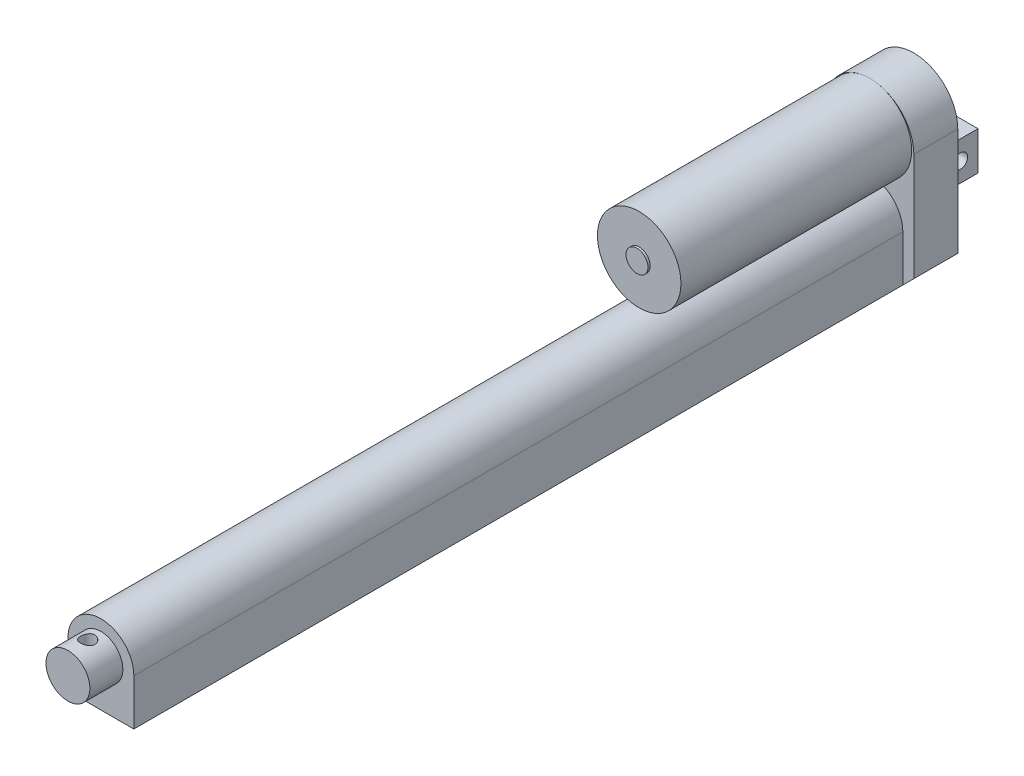
ISO-10303-21;
HEADER;
FILE_DESCRIPTION(('STEP AP214'),'2;1');
FILE_NAME('part.step','',(''),(''),'','','');
FILE_SCHEMA(('AUTOMOTIVE_DESIGN { 1 0 10303 214 1 1 1 1 }'));
ENDSEC;
DATA;
#1=APPLICATION_CONTEXT('core data for automotive mechanical design processes');
#2=APPLICATION_PROTOCOL_DEFINITION('international standard','automotive_design',2000,#1);
#3=PRODUCT_CONTEXT('',#1,'mechanical');
#4=PRODUCT('Part','Part','',(#3));
#5=PRODUCT_RELATED_PRODUCT_CATEGORY('part','',(#4));
#6=PRODUCT_DEFINITION_FORMATION('','',#4);
#7=PRODUCT_DEFINITION_CONTEXT('part definition',#1,'design');
#8=PRODUCT_DEFINITION('design','',#6,#7);
#9=PRODUCT_DEFINITION_SHAPE('','',#8);
#10=(LENGTH_UNIT() NAMED_UNIT(*) SI_UNIT(.MILLI.,.METRE.));
#11=(NAMED_UNIT(*) PLANE_ANGLE_UNIT() SI_UNIT($,.RADIAN.));
#12=(NAMED_UNIT(*) SI_UNIT($,.STERADIAN.) SOLID_ANGLE_UNIT());
#13=UNCERTAINTY_MEASURE_WITH_UNIT(LENGTH_MEASURE(1.E-05),#10,'distance_accuracy_value','');
#14=(GEOMETRIC_REPRESENTATION_CONTEXT(3) GLOBAL_UNCERTAINTY_ASSIGNED_CONTEXT((#13)) GLOBAL_UNIT_ASSIGNED_CONTEXT((#10,
#11,#12)) REPRESENTATION_CONTEXT('',''));
#15=CARTESIAN_POINT('',(0.,0.,0.));
#16=DIRECTION('',(0.,0.,1.));
#17=DIRECTION('',(1.,0.,0.));
#18=AXIS2_PLACEMENT_3D('',#15,#16,#17);
#19=CARTESIAN_POINT('',(0.,-16.,370.));
#20=DIRECTION('',(0.,0.,-1.));
#21=DIRECTION('',(-1.,0.,0.));
#22=AXIS2_PLACEMENT_3D('',#19,#20,#21);
#23=CYLINDRICAL_SURFACE('',#22,15.);
#24=DIRECTION('',(0.,0.,-1.));
#25=VECTOR('',#24,1.);
#26=CARTESIAN_POINT('',(-15.,-16.,370.));
#27=LINE('',#26,#25);
#28=CARTESIAN_POINT('',(-15.,-16.,370.));
#29=VERTEX_POINT('',#28);
#30=CARTESIAN_POINT('',(-15.,-16.,20.));
#31=VERTEX_POINT('',#30);
#32=EDGE_CURVE('E201',#29,#31,#27,.T.);
#33=ORIENTED_EDGE('',*,*,#32,.F.);
#34=CARTESIAN_POINT('',(0.,-16.,370.));
#35=DIRECTION('',(0.,0.,-1.));
#36=DIRECTION('',(-1.,0.,0.));
#37=AXIS2_PLACEMENT_3D('',#34,#35,#36);
#38=CIRCLE('',#37,15.);
#39=CARTESIAN_POINT('',(15.,-16.,370.));
#40=VERTEX_POINT('',#39);
#41=EDGE_CURVE('E259',#40,#29,#38,.F.);
#42=ORIENTED_EDGE('',*,*,#41,.F.);
#43=DIRECTION('',(0.,0.,-1.));
#44=VECTOR('',#43,1.);
#45=CARTESIAN_POINT('',(15.,-16.,370.));
#46=LINE('',#45,#44);
#47=CARTESIAN_POINT('',(15.,-16.,20.));
#48=VERTEX_POINT('',#47);
#49=EDGE_CURVE('E256',#48,#40,#46,.F.);
#50=ORIENTED_EDGE('',*,*,#49,.F.);
#51=CARTESIAN_POINT('',(0.,-16.,20.));
#52=DIRECTION('',(0.,0.,-1.));
#53=DIRECTION('',(-1.,0.,0.));
#54=AXIS2_PLACEMENT_3D('',#51,#52,#53);
#55=CIRCLE('',#54,15.);
#56=EDGE_CURVE('E52',#48,#31,#55,.F.);
#57=ORIENTED_EDGE('',*,*,#56,.T.);
#58=EDGE_LOOP('',(#33,#42,#50,#57));
#59=FACE_BOUND('',#58,.T.);
#60=ADVANCED_FACE('F38',(#59),#23,.T.);
#61=CARTESIAN_POINT('',(0.,0.,20.));
#62=DIRECTION('',(0.,0.,-1.));
#63=DIRECTION('',(-1.,0.,0.));
#64=AXIS2_PLACEMENT_3D('',#61,#62,#63);
#65=PLANE('',#64);
#66=DIRECTION('',(0.,-1.,0.));
#67=VECTOR('',#66,1.);
#68=CARTESIAN_POINT('',(-15.,-37.,20.));
#69=LINE('',#68,#67);
#70=CARTESIAN_POINT('',(-15.,-37.,20.));
#71=VERTEX_POINT('',#70);
#72=EDGE_CURVE('E175',#31,#71,#69,.T.);
#73=ORIENTED_EDGE('',*,*,#72,.F.);
#74=ORIENTED_EDGE('',*,*,#56,.F.);
#75=DIRECTION('',(0.,1.,0.));
#76=VECTOR('',#75,1.);
#77=CARTESIAN_POINT('',(15.,-37.,20.));
#78=LINE('',#77,#76);
#79=CARTESIAN_POINT('',(15.,-37.,20.));
#80=VERTEX_POINT('',#79);
#81=EDGE_CURVE('E180',#80,#48,#78,.T.);
#82=ORIENTED_EDGE('',*,*,#81,.F.);
#83=DIRECTION('',(-0.70710678118655,-0.707106781186546,0.));
#84=VECTOR('',#83,1.);
#85=CARTESIAN_POINT('',(20.,-32.,20.));
#86=LINE('',#85,#84);
#87=CARTESIAN_POINT('',(20.,-32.,20.));
#88=VERTEX_POINT('',#87);
#89=EDGE_CURVE('E252',#80,#88,#86,.F.);
#90=ORIENTED_EDGE('',*,*,#89,.T.);
#91=DIRECTION('',(0.,1.,0.));
#92=VECTOR('',#91,1.);
#93=CARTESIAN_POINT('',(20.,-37.,20.));
#94=LINE('',#93,#92);
#95=CARTESIAN_POINT('',(20.,17.,20.));
#96=VERTEX_POINT('',#95);
#97=EDGE_CURVE('E209',#88,#96,#94,.T.);
#98=ORIENTED_EDGE('',*,*,#97,.T.);
#99=CARTESIAN_POINT('',(0.,17.,20.));
#100=DIRECTION('',(0.,0.,-1.));
#101=DIRECTION('',(-1.,0.,0.));
#102=AXIS2_PLACEMENT_3D('',#99,#100,#101);
#103=CIRCLE('',#102,20.);
#104=CARTESIAN_POINT('',(4.11295489826725,36.5725216056802,20.));
#105=VERTEX_POINT('',#104);
#106=EDGE_CURVE('E231',#96,#105,#103,.F.);
#107=ORIENTED_EDGE('',*,*,#106,.T.);
#108=CARTESIAN_POINT('',(0.,18.0230309925982,20.));
#109=DIRECTION('',(0.,0.,1.));
#110=DIRECTION('',(1.,0.,0.));
#111=AXIS2_PLACEMENT_3D('',#108,#109,#110);
#112=CIRCLE('',#111,19.);
#113=CARTESIAN_POINT('',(-4.11295489826713,36.5725216056803,20.));
#114=VERTEX_POINT('',#113);
#115=EDGE_CURVE('E202',#114,#105,#112,.T.);
#116=ORIENTED_EDGE('',*,*,#115,.F.);
#117=CARTESIAN_POINT('',(-20.,17.,20.));
#118=VERTEX_POINT('',#117);
#119=EDGE_CURVE('E230',#114,#118,#103,.F.);
#120=ORIENTED_EDGE('',*,*,#119,.T.);
#121=DIRECTION('',(0.,-1.,0.));
#122=VECTOR('',#121,1.);
#123=CARTESIAN_POINT('',(-20.,-37.,20.));
#124=LINE('',#123,#122);
#125=CARTESIAN_POINT('',(-20.,-32.,20.));
#126=VERTEX_POINT('',#125);
#127=EDGE_CURVE('E211',#118,#126,#124,.T.);
#128=ORIENTED_EDGE('',*,*,#127,.T.);
#129=DIRECTION('',(-0.707106781186547,0.707106781186549,0.));
#130=VECTOR('',#129,1.);
#131=CARTESIAN_POINT('',(-15.,-37.,20.));
#132=LINE('',#131,#130);
#133=EDGE_CURVE('E241',#126,#71,#132,.F.);
#134=ORIENTED_EDGE('',*,*,#133,.T.);
#135=EDGE_LOOP('',(#73,#74,#82,#90,#98,#107,#116,#120,#128,#134));
#136=FACE_BOUND('',#135,.T.);
#137=ADVANCED_FACE('F284',(#136),#65,.F.);
#138=CARTESIAN_POINT('',(0.,17.,0.));
#139=DIRECTION('',(0.,0.,-1.));
#140=DIRECTION('',(-1.,0.,0.));
#141=AXIS2_PLACEMENT_3D('',#138,#139,#140);
#142=CYLINDRICAL_SURFACE('',#141,20.);
#143=DIRECTION('',(0.,0.,-1.));
#144=VECTOR('',#143,1.);
#145=CARTESIAN_POINT('',(20.,17.,20.));
#146=LINE('',#145,#144);
#147=CARTESIAN_POINT('',(20.,17.,0.));
#148=VERTEX_POINT('',#147);
#149=EDGE_CURVE('E215',#148,#96,#146,.F.);
#150=ORIENTED_EDGE('',*,*,#149,.F.);
#151=CARTESIAN_POINT('',(0.,17.,0.));
#152=DIRECTION('',(0.,0.,-1.));
#153=DIRECTION('',(-1.,0.,0.));
#154=AXIS2_PLACEMENT_3D('',#151,#152,#153);
#155=CIRCLE('',#154,20.);
#156=CARTESIAN_POINT('',(-20.,17.,0.));
#157=VERTEX_POINT('',#156);
#158=EDGE_CURVE('E227',#157,#148,#155,.T.);
#159=ORIENTED_EDGE('',*,*,#158,.F.);
#160=DIRECTION('',(0.,0.,-1.));
#161=VECTOR('',#160,1.);
#162=CARTESIAN_POINT('',(-20.,17.,20.));
#163=LINE('',#162,#161);
#164=EDGE_CURVE('E224',#118,#157,#163,.T.);
#165=ORIENTED_EDGE('',*,*,#164,.F.);
#166=ORIENTED_EDGE('',*,*,#119,.F.);
#167=EDGE_CURVE('E234',#105,#114,#103,.F.);
#168=ORIENTED_EDGE('',*,*,#167,.F.);
#169=ORIENTED_EDGE('',*,*,#106,.F.);
#170=EDGE_LOOP('',(#150,#159,#165,#166,#168,#169));
#171=FACE_BOUND('',#170,.T.);
#172=ADVANCED_FACE('F289',(#171),#142,.T.);
#173=CARTESIAN_POINT('',(20.,-37.,20.));
#174=DIRECTION('',(-1.,0.,0.));
#175=DIRECTION('',(0.,0.,1.));
#176=AXIS2_PLACEMENT_3D('',#173,#174,#175);
#177=PLANE('',#176);
#178=ORIENTED_EDGE('',*,*,#97,.F.);
#179=DIRECTION('',(0.,0.,-1.));
#180=VECTOR('',#179,1.);
#181=CARTESIAN_POINT('',(20.,-32.,20.));
#182=LINE('',#181,#180);
#183=CARTESIAN_POINT('',(20.,-32.,0.));
#184=VERTEX_POINT('',#183);
#185=EDGE_CURVE('E244',#88,#184,#182,.T.);
#186=ORIENTED_EDGE('',*,*,#185,.T.);
#187=DIRECTION('',(0.,1.,0.));
#188=VECTOR('',#187,1.);
#189=CARTESIAN_POINT('',(20.,-37.,0.));
#190=LINE('',#189,#188);
#191=EDGE_CURVE('E206',#184,#148,#190,.T.);
#192=ORIENTED_EDGE('',*,*,#191,.T.);
#193=ORIENTED_EDGE('',*,*,#149,.T.);
#194=EDGE_LOOP('',(#178,#186,#192,#193));
#195=FACE_BOUND('',#194,.T.);
#196=ADVANCED_FACE('F325',(#195),#177,.F.);
#197=CARTESIAN_POINT('',(-20.,-37.,20.));
#198=DIRECTION('',(1.,0.,0.));
#199=DIRECTION('',(0.,0.,-1.));
#200=AXIS2_PLACEMENT_3D('',#197,#198,#199);
#201=PLANE('',#200);
#202=DIRECTION('',(0.,-1.,0.));
#203=VECTOR('',#202,1.);
#204=CARTESIAN_POINT('',(-20.,-37.,0.));
#205=LINE('',#204,#203);
#206=CARTESIAN_POINT('',(-20.,-32.,0.));
#207=VERTEX_POINT('',#206);
#208=EDGE_CURVE('E217',#157,#207,#205,.T.);
#209=ORIENTED_EDGE('',*,*,#208,.T.);
#210=DIRECTION('',(0.,0.,1.));
#211=VECTOR('',#210,1.);
#212=CARTESIAN_POINT('',(-20.,-32.,20.));
#213=LINE('',#212,#211);
#214=EDGE_CURVE('E239',#207,#126,#213,.T.);
#215=ORIENTED_EDGE('',*,*,#214,.T.);
#216=ORIENTED_EDGE('',*,*,#127,.F.);
#217=ORIENTED_EDGE('',*,*,#164,.T.);
#218=EDGE_LOOP('',(#209,#215,#216,#217));
#219=FACE_BOUND('',#218,.T.);
#220=ADVANCED_FACE('F355',(#219),#201,.F.);
#221=CARTESIAN_POINT('',(-20.,-37.,20.));
#222=DIRECTION('',(0.,1.,0.));
#223=DIRECTION('',(0.,0.,1.));
#224=AXIS2_PLACEMENT_3D('',#221,#222,#223);
#225=PLANE('',#224);
#226=DIRECTION('',(1.,0.,0.));
#227=VECTOR('',#226,1.);
#228=CARTESIAN_POINT('',(-20.,-37.,0.));
#229=LINE('',#228,#227);
#230=CARTESIAN_POINT('',(-15.,-37.,0.));
#231=VERTEX_POINT('',#230);
#232=CARTESIAN_POINT('',(15.,-37.,0.));
#233=VERTEX_POINT('',#232);
#234=EDGE_CURVE('E212',#231,#233,#229,.T.);
#235=ORIENTED_EDGE('',*,*,#234,.T.);
#236=DIRECTION('',(0.,0.,1.));
#237=VECTOR('',#236,1.);
#238=CARTESIAN_POINT('',(15.,-37.,20.));
#239=LINE('',#238,#237);
#240=EDGE_CURVE('E249',#233,#80,#239,.T.);
#241=ORIENTED_EDGE('',*,*,#240,.T.);
#242=DIRECTION('',(0.,0.,-1.));
#243=VECTOR('',#242,1.);
#244=CARTESIAN_POINT('',(15.,-37.,370.));
#245=LINE('',#244,#243);
#246=CARTESIAN_POINT('',(15.,-37.,370.));
#247=VERTEX_POINT('',#246);
#248=EDGE_CURVE('E185',#247,#80,#245,.T.);
#249=ORIENTED_EDGE('',*,*,#248,.F.);
#250=DIRECTION('',(1.,0.,0.));
#251=VECTOR('',#250,1.);
#252=CARTESIAN_POINT('',(-15.,-37.,370.));
#253=LINE('',#252,#251);
#254=CARTESIAN_POINT('',(-15.,-37.,370.));
#255=VERTEX_POINT('',#254);
#256=EDGE_CURVE('E179',#255,#247,#253,.T.);
#257=ORIENTED_EDGE('',*,*,#256,.F.);
#258=DIRECTION('',(0.,0.,-1.));
#259=VECTOR('',#258,1.);
#260=CARTESIAN_POINT('',(-15.,-37.,370.));
#261=LINE('',#260,#259);
#262=EDGE_CURVE('E191',#255,#71,#261,.T.);
#263=ORIENTED_EDGE('',*,*,#262,.T.);
#264=DIRECTION('',(0.,0.,-1.));
#265=VECTOR('',#264,1.);
#266=CARTESIAN_POINT('',(-15.,-37.,20.));
#267=LINE('',#266,#265);
#268=EDGE_CURVE('E233',#71,#231,#267,.T.);
#269=ORIENTED_EDGE('',*,*,#268,.T.);
#270=EDGE_LOOP('',(#235,#241,#249,#257,#263,#269));
#271=FACE_BOUND('',#270,.T.);
#272=ADVANCED_FACE('F303',(#271),#225,.F.);
#273=CARTESIAN_POINT('',(0.,0.,0.));
#274=DIRECTION('',(0.,0.,-1.));
#275=DIRECTION('',(-1.,0.,0.));
#276=AXIS2_PLACEMENT_3D('',#273,#274,#275);
#277=PLANE('',#276);
#278=DIRECTION('',(0.,1.,0.));
#279=VECTOR('',#278,1.);
#280=CARTESIAN_POINT('',(-7.29139016690268,2.74999999999999,0.));
#281=LINE('',#280,#279);
#282=CARTESIAN_POINT('',(-7.29139016690269,-14.75,0.));
#283=VERTEX_POINT('',#282);
#284=CARTESIAN_POINT('',(-7.29139016690268,2.74999999999999,0.));
#285=VERTEX_POINT('',#284);
#286=EDGE_CURVE('E60',#283,#285,#281,.T.);
#287=ORIENTED_EDGE('',*,*,#286,.F.);
#288=DIRECTION('',(-1.,0.,0.));
#289=VECTOR('',#288,1.);
#290=CARTESIAN_POINT('',(10.2086098330973,-14.75,0.));
#291=LINE('',#290,#289);
#292=CARTESIAN_POINT('',(10.2086098330973,-14.75,0.));
#293=VERTEX_POINT('',#292);
#294=EDGE_CURVE('E64',#293,#283,#291,.T.);
#295=ORIENTED_EDGE('',*,*,#294,.F.);
#296=DIRECTION('',(0.,-1.,0.));
#297=VECTOR('',#296,1.);
#298=CARTESIAN_POINT('',(10.2086098330973,2.74999999999999,0.));
#299=LINE('',#298,#297);
#300=CARTESIAN_POINT('',(10.2086098330973,2.74999999999999,0.));
#301=VERTEX_POINT('',#300);
#302=EDGE_CURVE('E510',#301,#293,#299,.T.);
#303=ORIENTED_EDGE('',*,*,#302,.F.);
#304=DIRECTION('',(1.,0.,0.));
#305=VECTOR('',#304,1.);
#306=CARTESIAN_POINT('',(10.2086098330973,2.74999999999999,0.));
#307=LINE('',#306,#305);
#308=EDGE_CURVE('E502',#285,#301,#307,.T.);
#309=ORIENTED_EDGE('',*,*,#308,.F.);
#310=EDGE_LOOP('',(#287,#295,#303,#309));
#311=FACE_BOUND('',#310,.T.);
#312=ORIENTED_EDGE('',*,*,#191,.F.);
#313=DIRECTION('',(0.70710678118655,0.707106781186546,0.));
#314=VECTOR('',#313,1.);
#315=CARTESIAN_POINT('',(25.9999999999999,-26.0000000000001,0.));
#316=LINE('',#315,#314);
#317=EDGE_CURVE('E247',#184,#233,#316,.F.);
#318=ORIENTED_EDGE('',*,*,#317,.T.);
#319=ORIENTED_EDGE('',*,*,#234,.F.);
#320=DIRECTION('',(0.707106781186547,-0.707106781186549,0.));
#321=VECTOR('',#320,1.);
#322=CARTESIAN_POINT('',(-26.,-26.,0.));
#323=LINE('',#322,#321);
#324=EDGE_CURVE('E237',#231,#207,#323,.F.);
#325=ORIENTED_EDGE('',*,*,#324,.T.);
#326=ORIENTED_EDGE('',*,*,#208,.F.);
#327=ORIENTED_EDGE('',*,*,#158,.T.);
#328=EDGE_LOOP('',(#312,#318,#319,#325,#326,#327));
#329=FACE_BOUND('',#328,.T.);
#330=ADVANCED_FACE('F319',(#311,#329),#277,.T.);
#331=CARTESIAN_POINT('',(-15.,-37.,20.));
#332=DIRECTION('',(0.707106781186549,0.707106781186547,0.));
#333=DIRECTION('',(0.,0.,-1.));
#334=AXIS2_PLACEMENT_3D('',#331,#332,#333);
#335=PLANE('',#334);
#336=ORIENTED_EDGE('',*,*,#133,.F.);
#337=ORIENTED_EDGE('',*,*,#214,.F.);
#338=ORIENTED_EDGE('',*,*,#324,.F.);
#339=ORIENTED_EDGE('',*,*,#268,.F.);
#340=EDGE_LOOP('',(#336,#337,#338,#339));
#341=FACE_BOUND('',#340,.T.);
#342=ADVANCED_FACE('F315',(#341),#335,.F.);
#343=CARTESIAN_POINT('',(20.,-32.,20.));
#344=DIRECTION('',(-0.707106781186546,0.70710678118655,0.));
#345=DIRECTION('',(0.,0.,-1.));
#346=AXIS2_PLACEMENT_3D('',#343,#344,#345);
#347=PLANE('',#346);
#348=ORIENTED_EDGE('',*,*,#89,.F.);
#349=ORIENTED_EDGE('',*,*,#240,.F.);
#350=ORIENTED_EDGE('',*,*,#317,.F.);
#351=ORIENTED_EDGE('',*,*,#185,.F.);
#352=EDGE_LOOP('',(#348,#349,#350,#351));
#353=FACE_BOUND('',#352,.T.);
#354=ADVANCED_FACE('F323',(#353),#347,.F.);
#355=CARTESIAN_POINT('',(0.,18.0230309925982,20.));
#356=DIRECTION('',(0.,0.,1.));
#357=DIRECTION('',(1.,0.,0.));
#358=AXIS2_PLACEMENT_3D('',#355,#356,#357);
#359=PLANE('',#358);
#360=EDGE_CURVE('E197',#105,#114,#112,.T.);
#361=ORIENTED_EDGE('',*,*,#360,.F.);
#362=ORIENTED_EDGE('',*,*,#167,.T.);
#363=EDGE_LOOP('',(#361,#362));
#364=FACE_BOUND('',#363,.T.);
#365=ADVANCED_FACE('F338',(#364),#359,.F.);
#366=CARTESIAN_POINT('',(0.,18.0230309925982,125.));
#367=DIRECTION('',(0.,0.,-1.));
#368=DIRECTION('',(-1.,0.,0.));
#369=AXIS2_PLACEMENT_3D('',#366,#367,#368);
#370=CYLINDRICAL_SURFACE('',#369,19.);
#371=CARTESIAN_POINT('',(0.,18.0230309925982,125.));
#372=DIRECTION('',(0.,0.,1.));
#373=DIRECTION('',(1.,0.,0.));
#374=AXIS2_PLACEMENT_3D('',#371,#372,#373);
#375=CIRCLE('',#374,19.);
#376=CARTESIAN_POINT('',(19.,18.0230309925982,125.));
#377=VERTEX_POINT('',#376);
#378=EDGE_CURVE('E203',#377,#377,#375,.T.);
#379=ORIENTED_EDGE('',*,*,#378,.F.);
#380=EDGE_LOOP('',(#379));
#381=FACE_BOUND('',#380,.T.);
#382=ORIENTED_EDGE('',*,*,#360,.T.);
#383=ORIENTED_EDGE('',*,*,#115,.T.);
#384=EDGE_LOOP('',(#382,#383));
#385=FACE_BOUND('',#384,.T.);
#386=ADVANCED_FACE('F337',(#381,#385),#370,.T.);
#387=CARTESIAN_POINT('',(0.,18.0230309925982,125.));
#388=DIRECTION('',(0.,0.,1.));
#389=DIRECTION('',(1.,0.,0.));
#390=AXIS2_PLACEMENT_3D('',#387,#388,#389);
#391=PLANE('',#390);
#392=CARTESIAN_POINT('',(0.,18.0230309925982,125.));
#393=DIRECTION('',(0.,0.,1.));
#394=DIRECTION('',(1.,0.,0.));
#395=AXIS2_PLACEMENT_3D('',#392,#393,#394);
#396=CIRCLE('',#395,5.);
#397=CARTESIAN_POINT('',(5.,18.0230309925982,125.));
#398=VERTEX_POINT('',#397);
#399=EDGE_CURVE('E198',#398,#398,#396,.T.);
#400=ORIENTED_EDGE('',*,*,#399,.F.);
#401=EDGE_LOOP('',(#400));
#402=FACE_BOUND('',#401,.T.);
#403=ORIENTED_EDGE('',*,*,#378,.T.);
#404=EDGE_LOOP('',(#403));
#405=FACE_BOUND('',#404,.T.);
#406=ADVANCED_FACE('F345',(#402,#405),#391,.T.);
#407=CARTESIAN_POINT('',(0.,18.0230309925982,126.));
#408=DIRECTION('',(0.,0.,-1.));
#409=DIRECTION('',(-1.,0.,0.));
#410=AXIS2_PLACEMENT_3D('',#407,#408,#409);
#411=CYLINDRICAL_SURFACE('',#410,5.);
#412=CARTESIAN_POINT('',(0.,18.0230309925982,126.));
#413=DIRECTION('',(0.,0.,1.));
#414=DIRECTION('',(1.,0.,0.));
#415=AXIS2_PLACEMENT_3D('',#412,#413,#414);
#416=CIRCLE('',#415,5.);
#417=CARTESIAN_POINT('',(5.,18.0230309925982,126.));
#418=VERTEX_POINT('',#417);
#419=EDGE_CURVE('E194',#418,#418,#416,.T.);
#420=ORIENTED_EDGE('',*,*,#419,.F.);
#421=EDGE_LOOP('',(#420));
#422=FACE_BOUND('',#421,.T.);
#423=ORIENTED_EDGE('',*,*,#399,.T.);
#424=EDGE_LOOP('',(#423));
#425=FACE_BOUND('',#424,.T.);
#426=ADVANCED_FACE('F544',(#422,#425),#411,.T.);
#427=CARTESIAN_POINT('',(0.,18.0230309925982,126.));
#428=DIRECTION('',(0.,0.,1.));
#429=DIRECTION('',(1.,0.,0.));
#430=AXIS2_PLACEMENT_3D('',#427,#428,#429);
#431=PLANE('',#430);
#432=ORIENTED_EDGE('',*,*,#419,.T.);
#433=EDGE_LOOP('',(#432));
#434=FACE_BOUND('',#433,.T.);
#435=ADVANCED_FACE('F400',(#434),#431,.T.);
#436=CARTESIAN_POINT('',(-15.,-37.,370.));
#437=DIRECTION('',(1.,0.,0.));
#438=DIRECTION('',(0.,1.,0.));
#439=AXIS2_PLACEMENT_3D('',#436,#437,#438);
#440=PLANE('',#439);
#441=DIRECTION('',(0.,-1.,0.));
#442=VECTOR('',#441,1.);
#443=CARTESIAN_POINT('',(-15.,-37.,370.));
#444=LINE('',#443,#442);
#445=EDGE_CURVE('E177',#29,#255,#444,.T.);
#446=ORIENTED_EDGE('',*,*,#445,.F.);
#447=ORIENTED_EDGE('',*,*,#32,.T.);
#448=ORIENTED_EDGE('',*,*,#72,.T.);
#449=ORIENTED_EDGE('',*,*,#262,.F.);
#450=EDGE_LOOP('',(#446,#447,#448,#449));
#451=FACE_BOUND('',#450,.T.);
#452=ADVANCED_FACE('F298',(#451),#440,.F.);
#453=CARTESIAN_POINT('',(15.,-37.,370.));
#454=DIRECTION('',(-1.,0.,0.));
#455=DIRECTION('',(0.,-1.,0.));
#456=AXIS2_PLACEMENT_3D('',#453,#454,#455);
#457=PLANE('',#456);
#458=ORIENTED_EDGE('',*,*,#81,.T.);
#459=ORIENTED_EDGE('',*,*,#49,.T.);
#460=DIRECTION('',(0.,1.,0.));
#461=VECTOR('',#460,1.);
#462=CARTESIAN_POINT('',(15.,-37.,370.));
#463=LINE('',#462,#461);
#464=EDGE_CURVE('E182',#247,#40,#463,.T.);
#465=ORIENTED_EDGE('',*,*,#464,.F.);
#466=ORIENTED_EDGE('',*,*,#248,.T.);
#467=EDGE_LOOP('',(#458,#459,#465,#466));
#468=FACE_BOUND('',#467,.T.);
#469=ADVANCED_FACE('F308',(#468),#457,.F.);
#470=CARTESIAN_POINT('',(0.,0.,370.));
#471=DIRECTION('',(0.,0.,-1.));
#472=DIRECTION('',(-1.,0.,0.));
#473=AXIS2_PLACEMENT_3D('',#470,#471,#472);
#474=PLANE('',#473);
#475=CARTESIAN_POINT('',(0.,-16.,370.));
#476=DIRECTION('',(0.,0.,1.));
#477=DIRECTION('',(1.,0.,0.));
#478=AXIS2_PLACEMENT_3D('',#475,#476,#477);
#479=CIRCLE('',#478,10.);
#480=CARTESIAN_POINT('',(10.,-16.,370.));
#481=VERTEX_POINT('',#480);
#482=EDGE_CURVE('E11',#481,#481,#479,.T.);
#483=ORIENTED_EDGE('',*,*,#482,.F.);
#484=EDGE_LOOP('',(#483));
#485=FACE_BOUND('',#484,.T.);
#486=ORIENTED_EDGE('',*,*,#464,.T.);
#487=ORIENTED_EDGE('',*,*,#41,.T.);
#488=ORIENTED_EDGE('',*,*,#445,.T.);
#489=ORIENTED_EDGE('',*,*,#256,.T.);
#490=EDGE_LOOP('',(#486,#487,#488,#489));
#491=FACE_BOUND('',#490,.T.);
#492=ADVANCED_FACE('F281',(#485,#491),#474,.F.);
#493=CARTESIAN_POINT('',(0.,-16.,385.));
#494=DIRECTION('',(0.,0.,-1.));
#495=DIRECTION('',(-1.,0.,0.));
#496=AXIS2_PLACEMENT_3D('',#493,#494,#495);
#497=CYLINDRICAL_SURFACE('',#496,10.);
#498=CARTESIAN_POINT('',(0.,-26.,379.25));
#499=CARTESIAN_POINT('',(0.177579382949036,-25.9999998937457,379.249999978893));
#500=CARTESIAN_POINT('',(0.355160799428115,-25.9952257938611,379.235398036528));
#501=CARTESIAN_POINT('',(0.705108112257467,-25.9766501782423,379.177544333272));
#502=CARTESIAN_POINT('',(0.8774732056413,-25.9628472799953,379.134288184761));
#503=CARTESIAN_POINT('',(1.21189182680223,-25.9277171600686,379.020754772825));
#504=CARTESIAN_POINT('',(1.37396158278685,-25.9064021452577,378.950521329808));
#505=CARTESIAN_POINT('',(1.684022624021,-25.8584336143887,378.785220348216));
#506=CARTESIAN_POINT('',(1.83201134569424,-25.8317791289656,378.690148299311));
#507=CARTESIAN_POINT('',(2.11461081148199,-25.774959322478,378.474558938708));
#508=CARTESIAN_POINT('',(2.24869037174636,-25.7447129535853,378.353366806204));
#509=CARTESIAN_POINT('',(2.49502344091046,-25.6845736848256,378.090413033913));
#510=CARTESIAN_POINT('',(2.60727245498121,-25.6546808589392,377.94864716854));
#511=CARTESIAN_POINT('',(2.80972801137825,-25.5977505604902,377.643862973249));
#512=CARTESIAN_POINT('',(2.89925504445897,-25.5708123772724,377.480372950202));
#513=CARTESIAN_POINT('',(3.04931887139799,-25.5240683082348,377.139640099792));
#514=CARTESIAN_POINT('',(3.10986401524674,-25.5042603685244,376.962401250734));
#515=CARTESIAN_POINT('',(3.19827260971519,-25.4748706234853,376.605224003478));
#516=CARTESIAN_POINT('',(3.2271274104268,-25.4649795222656,376.425557170357));
#517=CARTESIAN_POINT('',(3.25443459132067,-25.4556270749359,376.063681042994));
#518=CARTESIAN_POINT('',(3.25289582251765,-25.4561626924252,375.881472504376));
#519=CARTESIAN_POINT('',(3.22023155138037,-25.4673313142313,375.528034921642));
#520=CARTESIAN_POINT('',(3.19038591816139,-25.4775275041788,375.356671424264));
#521=CARTESIAN_POINT('',(3.10403782395806,-25.5061557481236,375.021530266182));
#522=CARTESIAN_POINT('',(3.04753231830216,-25.5245887427866,374.85775347426));
#523=CARTESIAN_POINT('',(2.90860404188739,-25.5679344005213,374.539469725231));
#524=CARTESIAN_POINT('',(2.82579288678076,-25.5929431291382,374.385145941743));
#525=CARTESIAN_POINT('',(2.6368736518591,-25.6465806248091,374.092174070327));
#526=CARTESIAN_POINT('',(2.53075911343127,-25.6752103945125,373.953530344352));
#527=CARTESIAN_POINT('',(2.29204406554379,-25.7345964473776,373.688644194671));
#528=CARTESIAN_POINT('',(2.15839298888212,-25.7653878641468,373.56335456075));
#529=CARTESIAN_POINT('',(1.87159594889807,-25.8243847010851,373.336724933833));
#530=CARTESIAN_POINT('',(1.71844829781997,-25.8525898970094,373.235387016431));
#531=CARTESIAN_POINT('',(1.39505996296231,-25.9035754139869,373.058820419637));
#532=CARTESIAN_POINT('',(1.22467751353947,-25.9263044885687,372.983835581401));
#533=CARTESIAN_POINT('',(0.872803501369052,-25.9634057515847,372.863882450901));
#534=CARTESIAN_POINT('',(0.691315620659391,-25.9777806934397,372.818904268084));
#535=CARTESIAN_POINT('',(0.330457295677687,-25.9961031993807,372.761902689586));
#536=CARTESIAN_POINT('',(0.151310774152559,-26.0004581918424,372.748590876142));
#537=CARTESIAN_POINT('',(-0.206684753643008,-25.9994651511983,372.751644995372));
#538=CARTESIAN_POINT('',(-0.385533802797568,-25.9941186651287,372.76800619627));
#539=CARTESIAN_POINT('',(-0.7327770149291,-25.9745919088895,372.828916125414));
#540=CARTESIAN_POINT('',(-0.90132328437288,-25.9606565554401,372.872683874118));
#541=CARTESIAN_POINT('',(-1.22862125569253,-25.9256034314452,372.986197639871));
#542=CARTESIAN_POINT('',(-1.38737171915066,-25.9044847549493,373.05594693378));
#543=CARTESIAN_POINT('',(-1.69509055480487,-25.8565486903064,373.221427270234));
#544=CARTESIAN_POINT('',(-1.84370519348152,-25.829599442936,373.317776824875));
#545=CARTESIAN_POINT('',(-2.12308150730873,-25.7730688267669,373.532989903973));
#546=CARTESIAN_POINT('',(-2.25383795390917,-25.7434866912761,373.651859997817));
#547=CARTESIAN_POINT('',(-2.49964097258613,-25.68341394518,373.914800978044));
#548=CARTESIAN_POINT('',(-2.61376838975718,-25.6529390805777,374.059736741237));
#549=CARTESIAN_POINT('',(-2.81618275812034,-25.5958434922003,374.367361002655));
#550=CARTESIAN_POINT('',(-2.90446977360855,-25.5692227588355,374.530049456706));
#551=CARTESIAN_POINT('',(-3.05222465357594,-25.5231262672883,374.868452539395));
#552=CARTESIAN_POINT('',(-3.11177462835523,-25.5036301910465,375.044128380463));
#553=CARTESIAN_POINT('',(-3.20020095668876,-25.4742243815149,375.403787781573));
#554=CARTESIAN_POINT('',(-3.22909023717128,-25.4643106083648,375.587767806332));
#555=CARTESIAN_POINT('',(-3.25439854839942,-25.4556358687072,375.949140117443));
#556=CARTESIAN_POINT('',(-3.25233581624124,-25.4563533999892,376.126414793097));
#557=CARTESIAN_POINT('',(-3.21950614466644,-25.4675801666291,376.477953996167));
#558=CARTESIAN_POINT('',(-3.18874075712544,-25.4780888726045,376.652218685805));
#559=CARTESIAN_POINT('',(-3.10043070730135,-25.5073351191292,376.989832105728));
#560=CARTESIAN_POINT('',(-3.04335434275122,-25.5259284491393,377.153316786778));
#561=CARTESIAN_POINT('',(-2.9044172299681,-25.5692021691022,377.468517175449));
#562=CARTESIAN_POINT('',(-2.82255115849537,-25.5938838662348,377.620230346504));
#563=CARTESIAN_POINT('',(-2.63235879697991,-25.647840886364,377.914456183463));
#564=CARTESIAN_POINT('',(-2.52306891129123,-25.6772651752181,378.056318521375));
#565=CARTESIAN_POINT('',(-2.28278717900077,-25.7367438705035,378.320180906983));
#566=CARTESIAN_POINT('',(-2.15178933442874,-25.7667984490754,378.442175446628));
#567=CARTESIAN_POINT('',(-1.86608754817449,-25.8254625209376,378.667296798218));
#568=CARTESIAN_POINT('',(-1.71069498742676,-25.8539797754208,378.769576588143));
#569=CARTESIAN_POINT('',(-1.38400159009726,-25.9051409828211,378.946440653677));
#570=CARTESIAN_POINT('',(-1.21270574929996,-25.9277867717525,379.021033590156));
#571=CARTESIAN_POINT('',(-0.869832380696075,-25.96349655119,379.136333035991));
#572=CARTESIAN_POINT('',(-0.698908003473857,-25.977060307551,379.178827389201));
#573=CARTESIAN_POINT('',(-0.351988917437692,-25.9953110007797,379.235657443572));
#574=CARTESIAN_POINT('',(-0.175995457426617,-26.0000001053066,379.250000020918));
#575=CARTESIAN_POINT('',(0.,-26.,379.25));
#576=B_SPLINE_CURVE_WITH_KNOTS('',3,(#498,#499,#500,#501,#502,#503,#504,#505,#506,#507,#508,
#509,#510,#511,#512,#513,#514,#515,#516,#517,#518,#519,#520,#521,#522,#523,#524,#525,#526,#527,
#528,#529,#530,#531,#532,#533,#534,#535,#536,#537,#538,#539,#540,#541,#542,#543,#544,#545,#546,
#547,#548,#549,#550,#551,#552,#553,#554,#555,#556,#557,#558,#559,#560,#561,#562,#563,#564,#565,
#566,#567,#568,#569,#570,#571,#572,#573,#574,#575),.UNSPECIFIED.,.T.,.F.,(4,2,2,2,2,2,2,2,2,2,2,
2,2,2,2,2,2,2,2,2,2,2,2,2,2,2,2,2,2,2,2,2,2,2,2,2,2,2,4),(0.,0.532090801254682,1.06426309669592,
1.59557459199053,2.12698263287682,2.6742529630955,3.22163585524029,3.78384740278186,
4.34589687356045,4.88981368187711,5.43357209666658,5.95386117923413,6.4742096954303,
7.00262882865684,7.53119460031027,8.08590846442155,8.64067038102185,9.20043805582592,
9.76002113320911,10.2964148728263,10.8327230844865,11.3544036147969,11.8761499631049,
12.4112318399366,12.9464700445872,13.5047604456698,14.0630494576024,14.6197336846484,
15.176183113382,15.7054311330745,16.2346505394039,16.7547941299287,17.275049493252,
17.8170673976498,18.3592353135956,18.9211107593865,19.4828102935623,20.0102839458812,
20.5376287446081),.UNSPECIFIED.);
#577=CARTESIAN_POINT('',(0.,-26.,379.25));
#578=VERTEX_POINT('',#577);
#579=EDGE_CURVE('E42',#578,#578,#576,.T.);
#580=ORIENTED_EDGE('',*,*,#579,.T.);
#581=EDGE_LOOP('',(#580));
#582=FACE_BOUND('',#581,.T.);
#583=CARTESIAN_POINT('',(0.,-5.99999999999999,379.25));
#584=CARTESIAN_POINT('',(-0.177579382949036,-6.00000010625434,379.249999978893));
#585=CARTESIAN_POINT('',(-0.355160799428115,-6.00477420613892,379.235398036528));
#586=CARTESIAN_POINT('',(-0.705108112257467,-6.02334982175772,379.177544333272));
#587=CARTESIAN_POINT('',(-0.8774732056413,-6.03715272000471,379.134288184761));
#588=CARTESIAN_POINT('',(-1.21189182680223,-6.07228283993137,379.020754772825));
#589=CARTESIAN_POINT('',(-1.37396158278685,-6.0935978547423,378.950521329808));
#590=CARTESIAN_POINT('',(-1.684022624021,-6.14156638561128,378.785220348216));
#591=CARTESIAN_POINT('',(-1.83201134569424,-6.16822087103443,378.690148299311));
#592=CARTESIAN_POINT('',(-2.11461081148199,-6.22504067752203,378.474558938708));
#593=CARTESIAN_POINT('',(-2.24869037174636,-6.25528704641471,378.353366806204));
#594=CARTESIAN_POINT('',(-2.49502344091046,-6.31542631517439,378.090413033913));
#595=CARTESIAN_POINT('',(-2.60727245498121,-6.34531914106076,377.94864716854));
#596=CARTESIAN_POINT('',(-2.80972801137825,-6.40224943950984,377.643862973249));
#597=CARTESIAN_POINT('',(-2.89925504445897,-6.42918762272764,377.480372950202));
#598=CARTESIAN_POINT('',(-3.04931887139799,-6.47593169176523,377.139640099792));
#599=CARTESIAN_POINT('',(-3.10986401524674,-6.49573963147562,376.962401250734));
#600=CARTESIAN_POINT('',(-3.19827260971519,-6.52512937651469,376.605224003478));
#601=CARTESIAN_POINT('',(-3.2271274104268,-6.53502047773441,376.425557170357));
#602=CARTESIAN_POINT('',(-3.25443459132067,-6.54437292506405,376.063681042994));
#603=CARTESIAN_POINT('',(-3.25289582251765,-6.54383730757484,375.881472504376));
#604=CARTESIAN_POINT('',(-3.22023155138037,-6.53266868576871,375.528034921642));
#605=CARTESIAN_POINT('',(-3.19038591816139,-6.52247249582125,375.356671424264));
#606=CARTESIAN_POINT('',(-3.10403782395806,-6.49384425187644,375.021530266182));
#607=CARTESIAN_POINT('',(-3.04753231830216,-6.47541125721345,374.85775347426));
#608=CARTESIAN_POINT('',(-2.90860404188739,-6.43206559947865,374.539469725231));
#609=CARTESIAN_POINT('',(-2.82579288678076,-6.4070568708618,374.385145941743));
#610=CARTESIAN_POINT('',(-2.6368736518591,-6.35341937519086,374.092174070327));
#611=CARTESIAN_POINT('',(-2.53075911343127,-6.32478960548749,373.953530344352));
#612=CARTESIAN_POINT('',(-2.29204406554379,-6.26540355262238,373.688644194671));
#613=CARTESIAN_POINT('',(-2.15839298888212,-6.23461213585325,373.56335456075));
#614=CARTESIAN_POINT('',(-1.87159594889807,-6.17561529891493,373.336724933833));
#615=CARTESIAN_POINT('',(-1.71844829781997,-6.14741010299063,373.235387016431));
#616=CARTESIAN_POINT('',(-1.39505996296231,-6.09642458601308,373.058820419637));
#617=CARTESIAN_POINT('',(-1.22467751353947,-6.07369551143131,372.983835581401));
#618=CARTESIAN_POINT('',(-0.872803501369052,-6.03659424841532,372.863882450901));
#619=CARTESIAN_POINT('',(-0.691315620659392,-6.02221930656027,372.818904268084));
#620=CARTESIAN_POINT('',(-0.330457295677688,-6.00389680061931,372.761902689586));
#621=CARTESIAN_POINT('',(-0.151310774152561,-5.99954180815756,372.748590876142));
#622=CARTESIAN_POINT('',(0.206684753643006,-6.00053484880166,372.751644995372));
#623=CARTESIAN_POINT('',(0.385533802797567,-6.00588133487126,372.76800619627));
#624=CARTESIAN_POINT('',(0.732777014929099,-6.02540809111052,372.828916125414));
#625=CARTESIAN_POINT('',(0.901323284372877,-6.03934344455988,372.872683874118));
#626=CARTESIAN_POINT('',(1.22862125569253,-6.07439656855485,372.986197639871));
#627=CARTESIAN_POINT('',(1.38737171915066,-6.09551524505067,373.05594693378));
#628=CARTESIAN_POINT('',(1.69509055480488,-6.14345130969363,373.221427270234));
#629=CARTESIAN_POINT('',(1.84370519348153,-6.17040055706397,373.317776824875));
#630=CARTESIAN_POINT('',(2.12308150730874,-6.22693117323315,373.532989903973));
#631=CARTESIAN_POINT('',(2.25383795390918,-6.25651330872394,373.651859997817));
#632=CARTESIAN_POINT('',(2.49964097258614,-6.31658605482005,373.914800978044));
#633=CARTESIAN_POINT('',(2.61376838975718,-6.34706091942232,374.059736741237));
#634=CARTESIAN_POINT('',(2.81618275812034,-6.40415650779967,374.367361002655));
#635=CARTESIAN_POINT('',(2.90446977360855,-6.43077724116451,374.530049456706));
#636=CARTESIAN_POINT('',(3.05222465357594,-6.47687373271175,374.868452539395));
#637=CARTESIAN_POINT('',(3.11177462835523,-6.49636980895345,375.044128380463));
#638=CARTESIAN_POINT('',(3.20020095668876,-6.52577561848513,375.403787781573));
#639=CARTESIAN_POINT('',(3.22909023717128,-6.53568939163519,375.587767806332));
#640=CARTESIAN_POINT('',(3.25439854839942,-6.54436413129282,375.949140117443));
#641=CARTESIAN_POINT('',(3.25233581624124,-6.54364660001083,376.126414793097));
#642=CARTESIAN_POINT('',(3.21950614466645,-6.53241983337085,376.477953996167));
#643=CARTESIAN_POINT('',(3.18874075712544,-6.52191112739546,376.652218685805));
#644=CARTESIAN_POINT('',(3.10043070730135,-6.49266488087078,376.989832105728));
#645=CARTESIAN_POINT('',(3.04335434275122,-6.47407155086074,377.153316786778));
#646=CARTESIAN_POINT('',(2.9044172299681,-6.4307978308978,377.468517175449));
#647=CARTESIAN_POINT('',(2.82255115849536,-6.4061161337652,377.620230346504));
#648=CARTESIAN_POINT('',(2.6323587969799,-6.35215911363601,377.914456183463));
#649=CARTESIAN_POINT('',(2.52306891129122,-6.32273482478195,378.056318521375));
#650=CARTESIAN_POINT('',(2.28278717900075,-6.26325612949652,378.320180906983));
#651=CARTESIAN_POINT('',(2.15178933442873,-6.23320155092458,378.442175446629));
#652=CARTESIAN_POINT('',(1.86608754817448,-6.1745374790624,378.667296798218));
#653=CARTESIAN_POINT('',(1.71069498742676,-6.14602022457918,378.769576588143));
#654=CARTESIAN_POINT('',(1.38400159009726,-6.09485901717892,378.946440653677));
#655=CARTESIAN_POINT('',(1.21270574929996,-6.07221322824751,379.021033590156));
#656=CARTESIAN_POINT('',(0.869832380696075,-6.03650344880998,379.136333035991));
#657=CARTESIAN_POINT('',(0.698908003473856,-6.02293969244897,379.178827389201));
#658=CARTESIAN_POINT('',(0.351988917437692,-6.00468899922029,379.235657443572));
#659=CARTESIAN_POINT('',(0.175995457426617,-5.99999989469339,379.250000020918));
#660=CARTESIAN_POINT('',(0.,-5.99999999999999,379.25));
#661=B_SPLINE_CURVE_WITH_KNOTS('',3,(#583,#584,#585,#586,#587,#588,#589,#590,#591,#592,#593,
#594,#595,#596,#597,#598,#599,#600,#601,#602,#603,#604,#605,#606,#607,#608,#609,#610,#611,#612,
#613,#614,#615,#616,#617,#618,#619,#620,#621,#622,#623,#624,#625,#626,#627,#628,#629,#630,#631,
#632,#633,#634,#635,#636,#637,#638,#639,#640,#641,#642,#643,#644,#645,#646,#647,#648,#649,#650,
#651,#652,#653,#654,#655,#656,#657,#658,#659,#660),.UNSPECIFIED.,.T.,.F.,(4,2,2,2,2,2,2,2,2,2,2,
2,2,2,2,2,2,2,2,2,2,2,2,2,2,2,2,2,2,2,2,2,2,2,2,2,2,2,4),(0.,0.532090801254682,1.06426309669592,
1.59557459199053,2.12698263287682,2.6742529630955,3.22163585524029,3.78384740278186,
4.34589687356045,4.88981368187711,5.43357209666658,5.95386117923413,6.4742096954303,
7.00262882865684,7.53119460031027,8.08590846442155,8.64067038102185,9.20043805582592,
9.76002113320911,10.2964148728263,10.8327230844865,11.3544036147969,11.8761499631049,
12.4112318399367,12.9464700445872,13.5047604456698,14.0630494576024,14.6197336846484,
15.176183113382,15.7054311330744,16.2346505394039,16.7547941299287,17.275049493252,
17.8170673976499,18.3592353135956,18.9211107593865,19.4828102935623,20.0102839458812,
20.5376287446081),.UNSPECIFIED.);
#662=CARTESIAN_POINT('',(0.,-5.99999999999999,379.25));
#663=VERTEX_POINT('',#662);
#664=EDGE_CURVE('E166',#663,#663,#661,.T.);
#665=ORIENTED_EDGE('',*,*,#664,.T.);
#666=EDGE_LOOP('',(#665));
#667=FACE_BOUND('',#666,.T.);
#668=CARTESIAN_POINT('',(0.,-16.,385.));
#669=DIRECTION('',(0.,0.,1.));
#670=DIRECTION('',(1.,0.,0.));
#671=AXIS2_PLACEMENT_3D('',#668,#669,#670);
#672=CIRCLE('',#671,10.);
#673=CARTESIAN_POINT('',(10.,-16.,385.));
#674=VERTEX_POINT('',#673);
#675=EDGE_CURVE('E173',#674,#674,#672,.T.);
#676=ORIENTED_EDGE('',*,*,#675,.F.);
#677=EDGE_LOOP('',(#676));
#678=FACE_BOUND('',#677,.T.);
#679=ORIENTED_EDGE('',*,*,#482,.T.);
#680=EDGE_LOOP('',(#679));
#681=FACE_BOUND('',#680,.T.);
#682=ADVANCED_FACE('F264',(#582,#667,#678,#681),#497,.T.);
#683=CARTESIAN_POINT('',(0.,-16.,385.));
#684=DIRECTION('',(0.,0.,1.));
#685=DIRECTION('',(1.,0.,0.));
#686=AXIS2_PLACEMENT_3D('',#683,#684,#685);
#687=PLANE('',#686);
#688=ORIENTED_EDGE('',*,*,#675,.T.);
#689=EDGE_LOOP('',(#688));
#690=FACE_BOUND('',#689,.T.);
#691=ADVANCED_FACE('F272',(#690),#687,.T.);
#692=CARTESIAN_POINT('',(0.,-37.,376.));
#693=DIRECTION('',(0.,1.,0.));
#694=DIRECTION('',(0.,0.,1.));
#695=AXIS2_PLACEMENT_3D('',#692,#693,#694);
#696=CYLINDRICAL_SURFACE('',#695,3.25);
#697=ORIENTED_EDGE('',*,*,#664,.F.);
#698=EDGE_LOOP('',(#697));
#699=FACE_BOUND('',#698,.T.);
#700=ORIENTED_EDGE('',*,*,#579,.F.);
#701=EDGE_LOOP('',(#700));
#702=FACE_BOUND('',#701,.T.);
#703=ADVANCED_FACE('F268',(#699,#702),#696,.F.);
#704=CARTESIAN_POINT('',(-7.29139016690268,2.74999999999999,-19.));
#705=DIRECTION('',(1.,0.,0.));
#706=DIRECTION('',(0.,1.,0.));
#707=AXIS2_PLACEMENT_3D('',#704,#705,#706);
#708=PLANE('',#707);
#709=CARTESIAN_POINT('',(-7.29139016690269,-6.,-11.));
#710=DIRECTION('',(1.,0.,0.));
#711=DIRECTION('',(0.,1.,0.));
#712=AXIS2_PLACEMENT_3D('',#709,#710,#711);
#713=CIRCLE('',#712,3.25);
#714=CARTESIAN_POINT('',(-7.29139016690269,-2.75,-11.));
#715=VERTEX_POINT('',#714);
#716=EDGE_CURVE('E500',#715,#715,#713,.T.);
#717=ORIENTED_EDGE('',*,*,#716,.T.);
#718=EDGE_LOOP('',(#717));
#719=FACE_BOUND('',#718,.T.);
#720=ORIENTED_EDGE('',*,*,#286,.T.);
#721=DIRECTION('',(0.,0.,1.));
#722=VECTOR('',#721,1.);
#723=CARTESIAN_POINT('',(-7.29139016690268,2.74999999999999,-19.));
#724=LINE('',#723,#722);
#725=CARTESIAN_POINT('',(-7.29139016690268,2.74999999999999,-19.));
#726=VERTEX_POINT('',#725);
#727=EDGE_CURVE('E149',#726,#285,#724,.T.);
#728=ORIENTED_EDGE('',*,*,#727,.F.);
#729=DIRECTION('',(0.,1.,0.));
#730=VECTOR('',#729,1.);
#731=CARTESIAN_POINT('',(-7.29139016690268,2.74999999999999,-19.));
#732=LINE('',#731,#730);
#733=CARTESIAN_POINT('',(-7.29139016690269,-14.75,-19.));
#734=VERTEX_POINT('',#733);
#735=EDGE_CURVE('E155',#734,#726,#732,.T.);
#736=ORIENTED_EDGE('',*,*,#735,.F.);
#737=DIRECTION('',(0.,0.,1.));
#738=VECTOR('',#737,1.);
#739=CARTESIAN_POINT('',(-7.29139016690269,-14.75,-19.));
#740=LINE('',#739,#738);
#741=EDGE_CURVE('E507',#734,#283,#740,.T.);
#742=ORIENTED_EDGE('',*,*,#741,.T.);
#743=EDGE_LOOP('',(#720,#728,#736,#742));
#744=FACE_BOUND('',#743,.T.);
#745=ADVANCED_FACE('F165',(#719,#744),#708,.F.);
#746=CARTESIAN_POINT('',(10.2086098330973,2.74999999999999,-19.));
#747=DIRECTION('',(0.,-1.,0.));
#748=DIRECTION('',(0.,0.,-1.));
#749=AXIS2_PLACEMENT_3D('',#746,#747,#748);
#750=PLANE('',#749);
#751=ORIENTED_EDGE('',*,*,#308,.T.);
#752=DIRECTION('',(0.,0.,1.));
#753=VECTOR('',#752,1.);
#754=CARTESIAN_POINT('',(10.2086098330973,2.74999999999999,-19.));
#755=LINE('',#754,#753);
#756=CARTESIAN_POINT('',(10.2086098330973,2.74999999999999,-19.));
#757=VERTEX_POINT('',#756);
#758=EDGE_CURVE('E151',#757,#301,#755,.T.);
#759=ORIENTED_EDGE('',*,*,#758,.F.);
#760=DIRECTION('',(1.,0.,0.));
#761=VECTOR('',#760,1.);
#762=CARTESIAN_POINT('',(10.2086098330973,2.74999999999999,-19.));
#763=LINE('',#762,#761);
#764=EDGE_CURVE('E144',#726,#757,#763,.T.);
#765=ORIENTED_EDGE('',*,*,#764,.F.);
#766=ORIENTED_EDGE('',*,*,#727,.T.);
#767=EDGE_LOOP('',(#751,#759,#765,#766));
#768=FACE_BOUND('',#767,.T.);
#769=ADVANCED_FACE('F147',(#768),#750,.F.);
#770=CARTESIAN_POINT('',(10.2086098330973,2.74999999999999,-19.));
#771=DIRECTION('',(-1.,0.,0.));
#772=DIRECTION('',(0.,-1.,0.));
#773=AXIS2_PLACEMENT_3D('',#770,#771,#772);
#774=PLANE('',#773);
#775=CARTESIAN_POINT('',(10.2086098330973,-6.00000000000001,-11.));
#776=DIRECTION('',(1.,0.,0.));
#777=DIRECTION('',(0.,1.,0.));
#778=AXIS2_PLACEMENT_3D('',#775,#776,#777);
#779=CIRCLE('',#778,3.25);
#780=CARTESIAN_POINT('',(10.2086098330973,-2.75,-11.));
#781=VERTEX_POINT('',#780);
#782=EDGE_CURVE('E497',#781,#781,#779,.T.);
#783=ORIENTED_EDGE('',*,*,#782,.F.);
#784=EDGE_LOOP('',(#783));
#785=FACE_BOUND('',#784,.T.);
#786=ORIENTED_EDGE('',*,*,#302,.T.);
#787=DIRECTION('',(0.,0.,1.));
#788=VECTOR('',#787,1.);
#789=CARTESIAN_POINT('',(10.2086098330973,-14.75,-19.));
#790=LINE('',#789,#788);
#791=CARTESIAN_POINT('',(10.2086098330973,-14.75,-19.));
#792=VERTEX_POINT('',#791);
#793=EDGE_CURVE('E169',#792,#293,#790,.T.);
#794=ORIENTED_EDGE('',*,*,#793,.F.);
#795=DIRECTION('',(0.,-1.,0.));
#796=VECTOR('',#795,1.);
#797=CARTESIAN_POINT('',(10.2086098330973,2.74999999999999,-19.));
#798=LINE('',#797,#796);
#799=EDGE_CURVE('E154',#757,#792,#798,.T.);
#800=ORIENTED_EDGE('',*,*,#799,.F.);
#801=ORIENTED_EDGE('',*,*,#758,.T.);
#802=EDGE_LOOP('',(#786,#794,#800,#801));
#803=FACE_BOUND('',#802,.T.);
#804=ADVANCED_FACE('F448',(#785,#803),#774,.F.);
#805=CARTESIAN_POINT('',(10.2086098330973,-14.75,-19.));
#806=DIRECTION('',(0.,1.,0.));
#807=DIRECTION('',(0.,0.,1.));
#808=AXIS2_PLACEMENT_3D('',#805,#806,#807);
#809=PLANE('',#808);
#810=ORIENTED_EDGE('',*,*,#294,.T.);
#811=ORIENTED_EDGE('',*,*,#741,.F.);
#812=DIRECTION('',(-1.,0.,0.));
#813=VECTOR('',#812,1.);
#814=CARTESIAN_POINT('',(10.2086098330973,-14.75,-19.));
#815=LINE('',#814,#813);
#816=EDGE_CURVE('E160',#792,#734,#815,.T.);
#817=ORIENTED_EDGE('',*,*,#816,.F.);
#818=ORIENTED_EDGE('',*,*,#793,.T.);
#819=EDGE_LOOP('',(#810,#811,#817,#818));
#820=FACE_BOUND('',#819,.T.);
#821=ADVANCED_FACE('F454',(#820),#809,.F.);
#822=CARTESIAN_POINT('',(0.,0.,-19.));
#823=DIRECTION('',(0.,0.,-1.));
#824=DIRECTION('',(-1.,0.,0.));
#825=AXIS2_PLACEMENT_3D('',#822,#823,#824);
#826=PLANE('',#825);
#827=ORIENTED_EDGE('',*,*,#735,.T.);
#828=ORIENTED_EDGE('',*,*,#764,.T.);
#829=ORIENTED_EDGE('',*,*,#799,.T.);
#830=ORIENTED_EDGE('',*,*,#816,.T.);
#831=EDGE_LOOP('',(#827,#828,#829,#830));
#832=FACE_BOUND('',#831,.T.);
#833=ADVANCED_FACE('F158',(#832),#826,.T.);
#834=CARTESIAN_POINT('',(-20.,-6.,-11.));
#835=DIRECTION('',(1.,0.,0.));
#836=DIRECTION('',(0.,1.,0.));
#837=AXIS2_PLACEMENT_3D('',#834,#835,#836);
#838=CYLINDRICAL_SURFACE('',#837,3.25);
#839=ORIENTED_EDGE('',*,*,#782,.T.);
#840=EDGE_LOOP('',(#839));
#841=FACE_BOUND('',#840,.T.);
#842=ORIENTED_EDGE('',*,*,#716,.F.);
#843=EDGE_LOOP('',(#842));
#844=FACE_BOUND('',#843,.T.);
#845=ADVANCED_FACE('F468',(#841,#844),#838,.F.);
#846=CLOSED_SHELL('',(#60,#137,#172,#196,#220,#272,#330,#342,#354,#365,#386,#406,#426,#435,#452,
#469,#492,#682,#691,#703,#745,#769,#804,#821,#833,#845));
#847=MANIFOLD_SOLID_BREP('B2',#846);
#848=ADVANCED_BREP_SHAPE_REPRESENTATION('',(#18,#847),#14);
#849=SHAPE_DEFINITION_REPRESENTATION(#9,#848);
ENDSEC;
END-ISO-10303-21;
